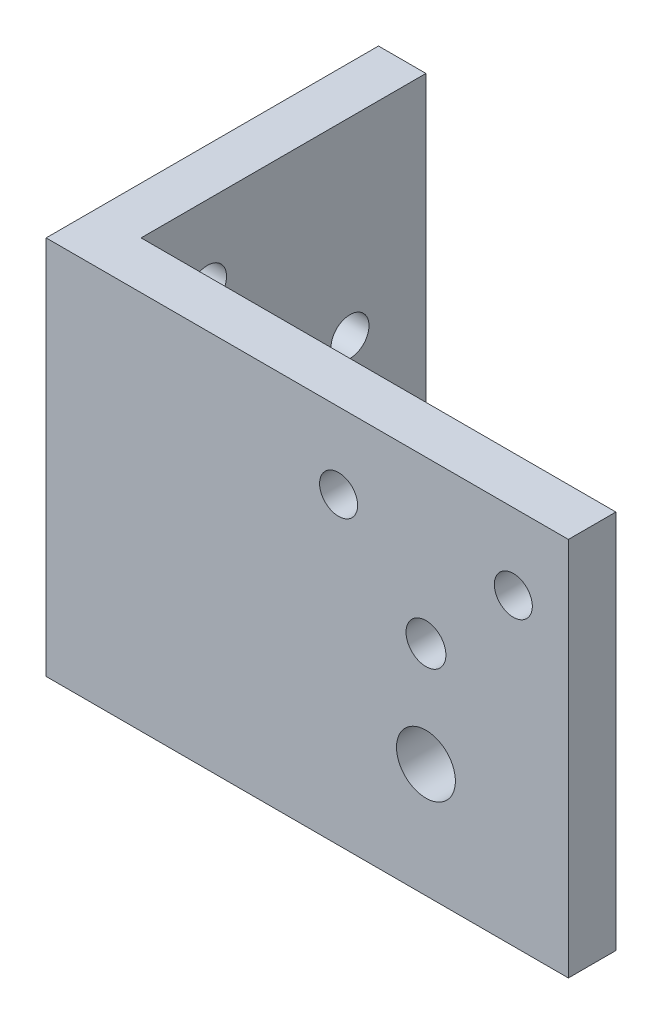
ISO-10303-21;
HEADER;
FILE_DESCRIPTION(('STEP AP214'),'2;1');
FILE_NAME('part.step','',(''),(''),'','','');
FILE_SCHEMA(('AUTOMOTIVE_DESIGN { 1 0 10303 214 1 1 1 1 }'));
ENDSEC;
DATA;
#1=APPLICATION_CONTEXT('core data for automotive mechanical design processes');
#2=APPLICATION_PROTOCOL_DEFINITION('international standard','automotive_design',2000,#1);
#3=PRODUCT_CONTEXT('',#1,'mechanical');
#4=PRODUCT('Part','Part','',(#3));
#5=PRODUCT_RELATED_PRODUCT_CATEGORY('part','',(#4));
#6=PRODUCT_DEFINITION_FORMATION('','',#4);
#7=PRODUCT_DEFINITION_CONTEXT('part definition',#1,'design');
#8=PRODUCT_DEFINITION('design','',#6,#7);
#9=PRODUCT_DEFINITION_SHAPE('','',#8);
#10=(LENGTH_UNIT() NAMED_UNIT(*) SI_UNIT(.MILLI.,.METRE.));
#11=(NAMED_UNIT(*) PLANE_ANGLE_UNIT() SI_UNIT($,.RADIAN.));
#12=(NAMED_UNIT(*) SI_UNIT($,.STERADIAN.) SOLID_ANGLE_UNIT());
#13=UNCERTAINTY_MEASURE_WITH_UNIT(LENGTH_MEASURE(1.E-05),#10,'distance_accuracy_value','');
#14=(GEOMETRIC_REPRESENTATION_CONTEXT(3) GLOBAL_UNCERTAINTY_ASSIGNED_CONTEXT((#13)) GLOBAL_UNIT_ASSIGNED_CONTEXT((#10,
#11,#12)) REPRESENTATION_CONTEXT('',''));
#15=CARTESIAN_POINT('',(0.,0.,0.));
#16=DIRECTION('',(0.,0.,1.));
#17=DIRECTION('',(1.,0.,0.));
#18=AXIS2_PLACEMENT_3D('',#15,#16,#17);
#19=CARTESIAN_POINT('',(5.,40.,-35.));
#20=DIRECTION('',(0.,0.,1.));
#21=DIRECTION('',(1.,0.,0.));
#22=AXIS2_PLACEMENT_3D('',#19,#20,#21);
#23=PLANE('',#22);
#24=DIRECTION('',(-1.,0.,0.));
#25=VECTOR('',#24,1.);
#26=CARTESIAN_POINT('',(5.,0.,-35.));
#27=LINE('',#26,#25);
#28=CARTESIAN_POINT('',(5.,0.,-35.));
#29=VERTEX_POINT('',#28);
#30=CARTESIAN_POINT('',(0.,0.,-35.));
#31=VERTEX_POINT('',#30);
#32=EDGE_CURVE('E119',#29,#31,#27,.T.);
#33=ORIENTED_EDGE('',*,*,#32,.T.);
#34=DIRECTION('',(0.,-1.,0.));
#35=VECTOR('',#34,1.);
#36=CARTESIAN_POINT('',(0.,40.,-35.));
#37=LINE('',#36,#35);
#38=CARTESIAN_POINT('',(0.,40.,-35.));
#39=VERTEX_POINT('',#38);
#40=EDGE_CURVE('E11',#39,#31,#37,.T.);
#41=ORIENTED_EDGE('',*,*,#40,.F.);
#42=DIRECTION('',(-1.,0.,0.));
#43=VECTOR('',#42,1.);
#44=CARTESIAN_POINT('',(5.,40.,-35.));
#45=LINE('',#44,#43);
#46=CARTESIAN_POINT('',(5.,40.,-35.));
#47=VERTEX_POINT('',#46);
#48=EDGE_CURVE('E130',#47,#39,#45,.T.);
#49=ORIENTED_EDGE('',*,*,#48,.F.);
#50=DIRECTION('',(0.,-1.,0.));
#51=VECTOR('',#50,1.);
#52=CARTESIAN_POINT('',(5.,40.,-35.));
#53=LINE('',#52,#51);
#54=EDGE_CURVE('E115',#47,#29,#53,.T.);
#55=ORIENTED_EDGE('',*,*,#54,.T.);
#56=EDGE_LOOP('',(#33,#41,#49,#55));
#57=FACE_BOUND('',#56,.T.);
#58=ADVANCED_FACE('F35',(#57),#23,.F.);
#59=CARTESIAN_POINT('',(0.,40.,-35.));
#60=DIRECTION('',(1.,0.,0.));
#61=DIRECTION('',(0.,0.,-1.));
#62=AXIS2_PLACEMENT_3D('',#59,#60,#61);
#63=PLANE('',#62);
#64=CARTESIAN_POINT('',(0.,32.,-12.));
#65=DIRECTION('',(1.,0.,0.));
#66=DIRECTION('',(0.,0.,-1.));
#67=AXIS2_PLACEMENT_3D('',#64,#65,#66);
#68=CIRCLE('',#67,2.);
#69=CARTESIAN_POINT('',(0.,32.,-14.));
#70=VERTEX_POINT('',#69);
#71=EDGE_CURVE('E280',#70,#70,#68,.T.);
#72=ORIENTED_EDGE('',*,*,#71,.T.);
#73=EDGE_LOOP('',(#72));
#74=FACE_BOUND('',#73,.T.);
#75=CARTESIAN_POINT('',(0.,20.,-27.));
#76=DIRECTION('',(1.,0.,0.));
#77=DIRECTION('',(0.,0.,-1.));
#78=AXIS2_PLACEMENT_3D('',#75,#76,#77);
#79=CIRCLE('',#78,2.);
#80=CARTESIAN_POINT('',(0.,20.,-29.));
#81=VERTEX_POINT('',#80);
#82=EDGE_CURVE('E288',#81,#81,#79,.T.);
#83=ORIENTED_EDGE('',*,*,#82,.T.);
#84=EDGE_LOOP('',(#83));
#85=FACE_BOUND('',#84,.T.);
#86=CARTESIAN_POINT('',(0.,8.,-12.));
#87=DIRECTION('',(1.,0.,0.));
#88=DIRECTION('',(0.,0.,-1.));
#89=AXIS2_PLACEMENT_3D('',#86,#87,#88);
#90=CIRCLE('',#89,2.);
#91=CARTESIAN_POINT('',(0.,8.,-14.));
#92=VERTEX_POINT('',#91);
#93=EDGE_CURVE('E296',#92,#92,#90,.T.);
#94=ORIENTED_EDGE('',*,*,#93,.T.);
#95=EDGE_LOOP('',(#94));
#96=FACE_BOUND('',#95,.T.);
#97=DIRECTION('',(0.,0.,1.));
#98=VECTOR('',#97,1.);
#99=CARTESIAN_POINT('',(0.,0.,-35.));
#100=LINE('',#99,#98);
#101=CARTESIAN_POINT('',(0.,0.,0.));
#102=VERTEX_POINT('',#101);
#103=EDGE_CURVE('E122',#31,#102,#100,.T.);
#104=ORIENTED_EDGE('',*,*,#103,.T.);
#105=DIRECTION('',(0.,-1.,0.));
#106=VECTOR('',#105,1.);
#107=CARTESIAN_POINT('',(0.,40.,0.));
#108=LINE('',#107,#106);
#109=CARTESIAN_POINT('',(0.,40.,0.));
#110=VERTEX_POINT('',#109);
#111=EDGE_CURVE('E43',#110,#102,#108,.T.);
#112=ORIENTED_EDGE('',*,*,#111,.F.);
#113=DIRECTION('',(0.,0.,1.));
#114=VECTOR('',#113,1.);
#115=CARTESIAN_POINT('',(0.,40.,-35.));
#116=LINE('',#115,#114);
#117=EDGE_CURVE('E88',#39,#110,#116,.T.);
#118=ORIENTED_EDGE('',*,*,#117,.F.);
#119=ORIENTED_EDGE('',*,*,#40,.T.);
#120=EDGE_LOOP('',(#104,#112,#118,#119));
#121=FACE_BOUND('',#120,.T.);
#122=ADVANCED_FACE('F158',(#74,#85,#96,#121),#63,.F.);
#123=CARTESIAN_POINT('',(0.,40.,0.));
#124=DIRECTION('',(0.,0.,-1.));
#125=DIRECTION('',(-1.,0.,0.));
#126=AXIS2_PLACEMENT_3D('',#123,#124,#125);
#127=PLANE('',#126);
#128=CARTESIAN_POINT('',(40.,12.,0.));
#129=DIRECTION('',(0.,0.,-1.));
#130=DIRECTION('',(-1.,0.,0.));
#131=AXIS2_PLACEMENT_3D('',#128,#129,#130);
#132=CIRCLE('',#131,3.1);
#133=CARTESIAN_POINT('',(36.9,12.,0.));
#134=VERTEX_POINT('',#133);
#135=EDGE_CURVE('E123',#134,#134,#132,.T.);
#136=ORIENTED_EDGE('',*,*,#135,.T.);
#137=EDGE_LOOP('',(#136));
#138=FACE_BOUND('',#137,.T.);
#139=CARTESIAN_POINT('',(40.,23.,0.));
#140=DIRECTION('',(0.,0.,-1.));
#141=DIRECTION('',(-1.,0.,0.));
#142=AXIS2_PLACEMENT_3D('',#139,#140,#141);
#143=CIRCLE('',#142,2.1);
#144=CARTESIAN_POINT('',(37.9,23.,0.));
#145=VERTEX_POINT('',#144);
#146=EDGE_CURVE('E304',#145,#145,#143,.T.);
#147=ORIENTED_EDGE('',*,*,#146,.T.);
#148=EDGE_LOOP('',(#147));
#149=FACE_BOUND('',#148,.T.);
#150=CARTESIAN_POINT('',(49.2,32.,0.));
#151=DIRECTION('',(0.,0.,-1.));
#152=DIRECTION('',(-1.,0.,0.));
#153=AXIS2_PLACEMENT_3D('',#150,#151,#152);
#154=CIRCLE('',#153,2.);
#155=CARTESIAN_POINT('',(47.2,32.,0.));
#156=VERTEX_POINT('',#155);
#157=EDGE_CURVE('E310',#156,#156,#154,.T.);
#158=ORIENTED_EDGE('',*,*,#157,.T.);
#159=EDGE_LOOP('',(#158));
#160=FACE_BOUND('',#159,.T.);
#161=CARTESIAN_POINT('',(30.8,32.,0.));
#162=DIRECTION('',(0.,0.,-1.));
#163=DIRECTION('',(-1.,0.,0.));
#164=AXIS2_PLACEMENT_3D('',#161,#162,#163);
#165=CIRCLE('',#164,2.);
#166=CARTESIAN_POINT('',(28.8,32.,0.));
#167=VERTEX_POINT('',#166);
#168=EDGE_CURVE('E316',#167,#167,#165,.T.);
#169=ORIENTED_EDGE('',*,*,#168,.T.);
#170=EDGE_LOOP('',(#169));
#171=FACE_BOUND('',#170,.T.);
#172=DIRECTION('',(1.,0.,0.));
#173=VECTOR('',#172,1.);
#174=CARTESIAN_POINT('',(0.,0.,0.));
#175=LINE('',#174,#173);
#176=CARTESIAN_POINT('',(55.,0.,0.));
#177=VERTEX_POINT('',#176);
#178=EDGE_CURVE('E125',#102,#177,#175,.T.);
#179=ORIENTED_EDGE('',*,*,#178,.T.);
#180=DIRECTION('',(0.,-1.,0.));
#181=VECTOR('',#180,1.);
#182=CARTESIAN_POINT('',(55.,40.,0.));
#183=LINE('',#182,#181);
#184=CARTESIAN_POINT('',(55.,40.,0.));
#185=VERTEX_POINT('',#184);
#186=EDGE_CURVE('E110',#185,#177,#183,.T.);
#187=ORIENTED_EDGE('',*,*,#186,.F.);
#188=DIRECTION('',(1.,0.,0.));
#189=VECTOR('',#188,1.);
#190=CARTESIAN_POINT('',(0.,40.,0.));
#191=LINE('',#190,#189);
#192=EDGE_CURVE('E101',#110,#185,#191,.T.);
#193=ORIENTED_EDGE('',*,*,#192,.F.);
#194=ORIENTED_EDGE('',*,*,#111,.T.);
#195=EDGE_LOOP('',(#179,#187,#193,#194));
#196=FACE_BOUND('',#195,.T.);
#197=ADVANCED_FACE('F136',(#138,#149,#160,#171,#196),#127,.F.);
#198=CARTESIAN_POINT('',(55.,40.,0.));
#199=DIRECTION('',(-1.,0.,0.));
#200=DIRECTION('',(0.,0.,1.));
#201=AXIS2_PLACEMENT_3D('',#198,#199,#200);
#202=PLANE('',#201);
#203=DIRECTION('',(0.,0.,-1.));
#204=VECTOR('',#203,1.);
#205=CARTESIAN_POINT('',(55.,0.,0.));
#206=LINE('',#205,#204);
#207=CARTESIAN_POINT('',(55.,0.,-5.));
#208=VERTEX_POINT('',#207);
#209=EDGE_CURVE('E109',#177,#208,#206,.T.);
#210=ORIENTED_EDGE('',*,*,#209,.T.);
#211=DIRECTION('',(0.,-1.,0.));
#212=VECTOR('',#211,1.);
#213=CARTESIAN_POINT('',(55.,40.,-5.));
#214=LINE('',#213,#212);
#215=CARTESIAN_POINT('',(55.,40.,-5.));
#216=VERTEX_POINT('',#215);
#217=EDGE_CURVE('E106',#216,#208,#214,.T.);
#218=ORIENTED_EDGE('',*,*,#217,.F.);
#219=DIRECTION('',(0.,0.,-1.));
#220=VECTOR('',#219,1.);
#221=CARTESIAN_POINT('',(55.,40.,0.));
#222=LINE('',#221,#220);
#223=EDGE_CURVE('E95',#185,#216,#222,.T.);
#224=ORIENTED_EDGE('',*,*,#223,.F.);
#225=ORIENTED_EDGE('',*,*,#186,.T.);
#226=EDGE_LOOP('',(#210,#218,#224,#225));
#227=FACE_BOUND('',#226,.T.);
#228=ADVANCED_FACE('F107',(#227),#202,.F.);
#229=CARTESIAN_POINT('',(55.,40.,-5.));
#230=DIRECTION('',(0.,0.,1.));
#231=DIRECTION('',(1.,0.,0.));
#232=AXIS2_PLACEMENT_3D('',#229,#230,#231);
#233=PLANE('',#232);
#234=CARTESIAN_POINT('',(40.,12.,-5.));
#235=DIRECTION('',(0.,0.,-1.));
#236=DIRECTION('',(-1.,0.,0.));
#237=AXIS2_PLACEMENT_3D('',#234,#235,#236);
#238=CIRCLE('',#237,3.1);
#239=CARTESIAN_POINT('',(36.9,12.,-5.));
#240=VERTEX_POINT('',#239);
#241=EDGE_CURVE('E301',#240,#240,#238,.T.);
#242=ORIENTED_EDGE('',*,*,#241,.F.);
#243=EDGE_LOOP('',(#242));
#244=FACE_BOUND('',#243,.T.);
#245=CARTESIAN_POINT('',(40.,23.,-5.));
#246=DIRECTION('',(0.,0.,-1.));
#247=DIRECTION('',(-1.,0.,0.));
#248=AXIS2_PLACEMENT_3D('',#245,#246,#247);
#249=CIRCLE('',#248,2.1);
#250=CARTESIAN_POINT('',(37.9,23.,-5.));
#251=VERTEX_POINT('',#250);
#252=EDGE_CURVE('E307',#251,#251,#249,.T.);
#253=ORIENTED_EDGE('',*,*,#252,.F.);
#254=EDGE_LOOP('',(#253));
#255=FACE_BOUND('',#254,.T.);
#256=CARTESIAN_POINT('',(49.2,32.,-5.));
#257=DIRECTION('',(0.,0.,-1.));
#258=DIRECTION('',(-1.,0.,0.));
#259=AXIS2_PLACEMENT_3D('',#256,#257,#258);
#260=CIRCLE('',#259,2.);
#261=CARTESIAN_POINT('',(47.2,32.,-5.));
#262=VERTEX_POINT('',#261);
#263=EDGE_CURVE('E313',#262,#262,#260,.T.);
#264=ORIENTED_EDGE('',*,*,#263,.F.);
#265=EDGE_LOOP('',(#264));
#266=FACE_BOUND('',#265,.T.);
#267=CARTESIAN_POINT('',(30.8,32.,-5.));
#268=DIRECTION('',(0.,0.,-1.));
#269=DIRECTION('',(-1.,0.,0.));
#270=AXIS2_PLACEMENT_3D('',#267,#268,#269);
#271=CIRCLE('',#270,2.);
#272=CARTESIAN_POINT('',(28.8,32.,-5.));
#273=VERTEX_POINT('',#272);
#274=EDGE_CURVE('E285',#273,#273,#271,.T.);
#275=ORIENTED_EDGE('',*,*,#274,.F.);
#276=EDGE_LOOP('',(#275));
#277=FACE_BOUND('',#276,.T.);
#278=DIRECTION('',(-1.,0.,0.));
#279=VECTOR('',#278,1.);
#280=CARTESIAN_POINT('',(55.,0.,-5.));
#281=LINE('',#280,#279);
#282=CARTESIAN_POINT('',(5.00000000000001,0.,-4.99999999999999));
#283=VERTEX_POINT('',#282);
#284=EDGE_CURVE('E74',#208,#283,#281,.T.);
#285=ORIENTED_EDGE('',*,*,#284,.T.);
#286=DIRECTION('',(0.,-1.,0.));
#287=VECTOR('',#286,1.);
#288=CARTESIAN_POINT('',(5.00000000000001,40.,-4.99999999999999));
#289=LINE('',#288,#287);
#290=CARTESIAN_POINT('',(5.00000000000001,40.,-4.99999999999999));
#291=VERTEX_POINT('',#290);
#292=EDGE_CURVE('E111',#291,#283,#289,.T.);
#293=ORIENTED_EDGE('',*,*,#292,.F.);
#294=DIRECTION('',(-1.,0.,0.));
#295=VECTOR('',#294,1.);
#296=CARTESIAN_POINT('',(55.,40.,-5.));
#297=LINE('',#296,#295);
#298=EDGE_CURVE('E99',#216,#291,#297,.T.);
#299=ORIENTED_EDGE('',*,*,#298,.F.);
#300=ORIENTED_EDGE('',*,*,#217,.T.);
#301=EDGE_LOOP('',(#285,#293,#299,#300));
#302=FACE_BOUND('',#301,.T.);
#303=ADVANCED_FACE('F113',(#244,#255,#266,#277,#302),#233,.F.);
#304=CARTESIAN_POINT('',(5.00000000000001,40.,-4.99999999999999));
#305=DIRECTION('',(-1.,0.,0.));
#306=DIRECTION('',(0.,0.,1.));
#307=AXIS2_PLACEMENT_3D('',#304,#305,#306);
#308=PLANE('',#307);
#309=CARTESIAN_POINT('',(5.,32.,-12.));
#310=DIRECTION('',(1.,0.,0.));
#311=DIRECTION('',(0.,0.,-1.));
#312=AXIS2_PLACEMENT_3D('',#309,#310,#311);
#313=CIRCLE('',#312,2.);
#314=CARTESIAN_POINT('',(5.,32.,-14.));
#315=VERTEX_POINT('',#314);
#316=EDGE_CURVE('E282',#315,#315,#313,.T.);
#317=ORIENTED_EDGE('',*,*,#316,.F.);
#318=EDGE_LOOP('',(#317));
#319=FACE_BOUND('',#318,.T.);
#320=CARTESIAN_POINT('',(5.,20.,-27.));
#321=DIRECTION('',(1.,0.,0.));
#322=DIRECTION('',(0.,0.,-1.));
#323=AXIS2_PLACEMENT_3D('',#320,#321,#322);
#324=CIRCLE('',#323,2.);
#325=CARTESIAN_POINT('',(5.,20.,-29.));
#326=VERTEX_POINT('',#325);
#327=EDGE_CURVE('E283',#326,#326,#324,.T.);
#328=ORIENTED_EDGE('',*,*,#327,.F.);
#329=EDGE_LOOP('',(#328));
#330=FACE_BOUND('',#329,.T.);
#331=CARTESIAN_POINT('',(5.,8.,-12.));
#332=DIRECTION('',(1.,0.,0.));
#333=DIRECTION('',(0.,0.,-1.));
#334=AXIS2_PLACEMENT_3D('',#331,#332,#333);
#335=CIRCLE('',#334,2.);
#336=CARTESIAN_POINT('',(5.,8.,-14.));
#337=VERTEX_POINT('',#336);
#338=EDGE_CURVE('E293',#337,#337,#335,.T.);
#339=ORIENTED_EDGE('',*,*,#338,.F.);
#340=EDGE_LOOP('',(#339));
#341=FACE_BOUND('',#340,.T.);
#342=DIRECTION('',(0.,0.,-1.));
#343=VECTOR('',#342,1.);
#344=CARTESIAN_POINT('',(5.00000000000001,0.,-4.99999999999999));
#345=LINE('',#344,#343);
#346=EDGE_CURVE('E80',#283,#29,#345,.T.);
#347=ORIENTED_EDGE('',*,*,#346,.T.);
#348=ORIENTED_EDGE('',*,*,#54,.F.);
#349=DIRECTION('',(0.,0.,-1.));
#350=VECTOR('',#349,1.);
#351=CARTESIAN_POINT('',(5.00000000000001,40.,-4.99999999999999));
#352=LINE('',#351,#350);
#353=EDGE_CURVE('E51',#291,#47,#352,.T.);
#354=ORIENTED_EDGE('',*,*,#353,.F.);
#355=ORIENTED_EDGE('',*,*,#292,.T.);
#356=EDGE_LOOP('',(#347,#348,#354,#355));
#357=FACE_BOUND('',#356,.T.);
#358=ADVANCED_FACE('F143',(#319,#330,#341,#357),#308,.F.);
#359=CARTESIAN_POINT('',(0.,40.,0.));
#360=DIRECTION('',(0.,1.,0.));
#361=DIRECTION('',(0.,0.,1.));
#362=AXIS2_PLACEMENT_3D('',#359,#360,#361);
#363=PLANE('',#362);
#364=ORIENTED_EDGE('',*,*,#48,.T.);
#365=ORIENTED_EDGE('',*,*,#117,.T.);
#366=ORIENTED_EDGE('',*,*,#192,.T.);
#367=ORIENTED_EDGE('',*,*,#223,.T.);
#368=ORIENTED_EDGE('',*,*,#298,.T.);
#369=ORIENTED_EDGE('',*,*,#353,.T.);
#370=EDGE_LOOP('',(#364,#365,#366,#367,#368,#369));
#371=FACE_BOUND('',#370,.T.);
#372=ADVANCED_FACE('F97',(#371),#363,.T.);
#373=CARTESIAN_POINT('',(0.,0.,0.));
#374=DIRECTION('',(0.,1.,0.));
#375=DIRECTION('',(0.,0.,1.));
#376=AXIS2_PLACEMENT_3D('',#373,#374,#375);
#377=PLANE('',#376);
#378=ORIENTED_EDGE('',*,*,#32,.F.);
#379=ORIENTED_EDGE('',*,*,#346,.F.);
#380=ORIENTED_EDGE('',*,*,#284,.F.);
#381=ORIENTED_EDGE('',*,*,#209,.F.);
#382=ORIENTED_EDGE('',*,*,#178,.F.);
#383=ORIENTED_EDGE('',*,*,#103,.F.);
#384=EDGE_LOOP('',(#378,#379,#380,#381,#382,#383));
#385=FACE_BOUND('',#384,.T.);
#386=ADVANCED_FACE('F139',(#385),#377,.F.);
#387=CARTESIAN_POINT('',(30.8,32.,0.));
#388=DIRECTION('',(0.,0.,-1.));
#389=DIRECTION('',(-1.,0.,0.));
#390=AXIS2_PLACEMENT_3D('',#387,#388,#389);
#391=CYLINDRICAL_SURFACE('',#390,2.);
#392=ORIENTED_EDGE('',*,*,#168,.F.);
#393=EDGE_LOOP('',(#392));
#394=FACE_BOUND('',#393,.T.);
#395=ORIENTED_EDGE('',*,*,#274,.T.);
#396=EDGE_LOOP('',(#395));
#397=FACE_BOUND('',#396,.T.);
#398=ADVANCED_FACE('F190',(#394,#397),#391,.F.);
#399=CARTESIAN_POINT('',(49.2,32.,0.));
#400=DIRECTION('',(0.,0.,-1.));
#401=DIRECTION('',(-1.,0.,0.));
#402=AXIS2_PLACEMENT_3D('',#399,#400,#401);
#403=CYLINDRICAL_SURFACE('',#402,2.);
#404=ORIENTED_EDGE('',*,*,#157,.F.);
#405=EDGE_LOOP('',(#404));
#406=FACE_BOUND('',#405,.T.);
#407=ORIENTED_EDGE('',*,*,#263,.T.);
#408=EDGE_LOOP('',(#407));
#409=FACE_BOUND('',#408,.T.);
#410=ADVANCED_FACE('F195',(#406,#409),#403,.F.);
#411=CARTESIAN_POINT('',(40.,23.,0.));
#412=DIRECTION('',(0.,0.,-1.));
#413=DIRECTION('',(-1.,0.,0.));
#414=AXIS2_PLACEMENT_3D('',#411,#412,#413);
#415=CYLINDRICAL_SURFACE('',#414,2.1);
#416=ORIENTED_EDGE('',*,*,#146,.F.);
#417=EDGE_LOOP('',(#416));
#418=FACE_BOUND('',#417,.T.);
#419=ORIENTED_EDGE('',*,*,#252,.T.);
#420=EDGE_LOOP('',(#419));
#421=FACE_BOUND('',#420,.T.);
#422=ADVANCED_FACE('F207',(#418,#421),#415,.F.);
#423=CARTESIAN_POINT('',(40.,12.,0.));
#424=DIRECTION('',(0.,0.,-1.));
#425=DIRECTION('',(-1.,0.,0.));
#426=AXIS2_PLACEMENT_3D('',#423,#424,#425);
#427=CYLINDRICAL_SURFACE('',#426,3.1);
#428=ORIENTED_EDGE('',*,*,#135,.F.);
#429=EDGE_LOOP('',(#428));
#430=FACE_BOUND('',#429,.T.);
#431=ORIENTED_EDGE('',*,*,#241,.T.);
#432=EDGE_LOOP('',(#431));
#433=FACE_BOUND('',#432,.T.);
#434=ADVANCED_FACE('F217',(#430,#433),#427,.F.);
#435=CARTESIAN_POINT('',(0.,8.,-12.));
#436=DIRECTION('',(1.,0.,0.));
#437=DIRECTION('',(0.,0.,-1.));
#438=AXIS2_PLACEMENT_3D('',#435,#436,#437);
#439=CYLINDRICAL_SURFACE('',#438,2.);
#440=ORIENTED_EDGE('',*,*,#93,.F.);
#441=EDGE_LOOP('',(#440));
#442=FACE_BOUND('',#441,.T.);
#443=ORIENTED_EDGE('',*,*,#338,.T.);
#444=EDGE_LOOP('',(#443));
#445=FACE_BOUND('',#444,.T.);
#446=ADVANCED_FACE('F226',(#442,#445),#439,.F.);
#447=CARTESIAN_POINT('',(0.,20.,-27.));
#448=DIRECTION('',(1.,0.,0.));
#449=DIRECTION('',(0.,0.,-1.));
#450=AXIS2_PLACEMENT_3D('',#447,#448,#449);
#451=CYLINDRICAL_SURFACE('',#450,2.);
#452=ORIENTED_EDGE('',*,*,#82,.F.);
#453=EDGE_LOOP('',(#452));
#454=FACE_BOUND('',#453,.T.);
#455=ORIENTED_EDGE('',*,*,#327,.T.);
#456=EDGE_LOOP('',(#455));
#457=FACE_BOUND('',#456,.T.);
#458=ADVANCED_FACE('F246',(#454,#457),#451,.F.);
#459=CARTESIAN_POINT('',(0.,32.,-12.));
#460=DIRECTION('',(1.,0.,0.));
#461=DIRECTION('',(0.,0.,-1.));
#462=AXIS2_PLACEMENT_3D('',#459,#460,#461);
#463=CYLINDRICAL_SURFACE('',#462,2.);
#464=ORIENTED_EDGE('',*,*,#71,.F.);
#465=EDGE_LOOP('',(#464));
#466=FACE_BOUND('',#465,.T.);
#467=ORIENTED_EDGE('',*,*,#316,.T.);
#468=EDGE_LOOP('',(#467));
#469=FACE_BOUND('',#468,.T.);
#470=ADVANCED_FACE('F256',(#466,#469),#463,.F.);
#471=CLOSED_SHELL('',(#58,#122,#197,#228,#303,#358,#372,#386,#398,#410,#422,#434,#446,#458,#470));
#472=MANIFOLD_SOLID_BREP('B2',#471);
#473=ADVANCED_BREP_SHAPE_REPRESENTATION('',(#18,#472),#14);
#474=SHAPE_DEFINITION_REPRESENTATION(#9,#473);
ENDSEC;
END-ISO-10303-21;
